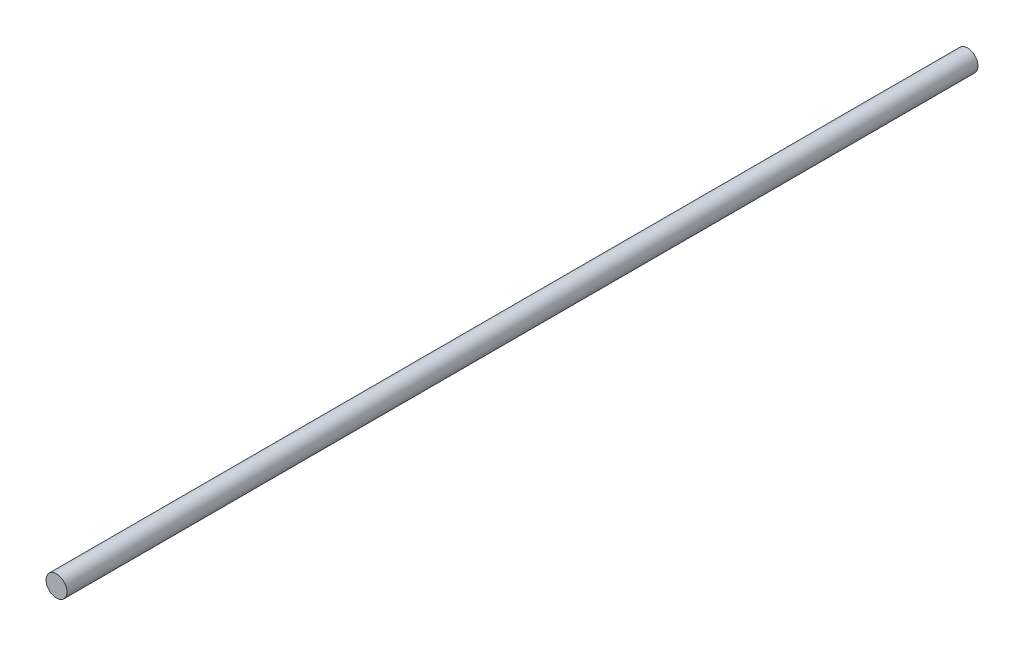
ISO-10303-21;
HEADER;
FILE_DESCRIPTION(('STEP AP214'),'2;1');
FILE_NAME('part.step','',(''),(''),'','','');
FILE_SCHEMA(('AUTOMOTIVE_DESIGN { 1 0 10303 214 1 1 1 1 }'));
ENDSEC;
DATA;
#1=APPLICATION_CONTEXT('core data for automotive mechanical design processes');
#2=APPLICATION_PROTOCOL_DEFINITION('international standard','automotive_design',2000,#1);
#3=PRODUCT_CONTEXT('',#1,'mechanical');
#4=PRODUCT('Part','Part','',(#3));
#5=PRODUCT_RELATED_PRODUCT_CATEGORY('part','',(#4));
#6=PRODUCT_DEFINITION_FORMATION('','',#4);
#7=PRODUCT_DEFINITION_CONTEXT('part definition',#1,'design');
#8=PRODUCT_DEFINITION('design','',#6,#7);
#9=PRODUCT_DEFINITION_SHAPE('','',#8);
#10=(LENGTH_UNIT() NAMED_UNIT(*) SI_UNIT(.MILLI.,.METRE.));
#11=(NAMED_UNIT(*) PLANE_ANGLE_UNIT() SI_UNIT($,.RADIAN.));
#12=(NAMED_UNIT(*) SI_UNIT($,.STERADIAN.) SOLID_ANGLE_UNIT());
#13=UNCERTAINTY_MEASURE_WITH_UNIT(LENGTH_MEASURE(1.E-05),#10,'distance_accuracy_value','');
#14=(GEOMETRIC_REPRESENTATION_CONTEXT(3) GLOBAL_UNCERTAINTY_ASSIGNED_CONTEXT((#13)) GLOBAL_UNIT_ASSIGNED_CONTEXT((#10,
#11,#12)) REPRESENTATION_CONTEXT('',''));
#15=CARTESIAN_POINT('',(0.,0.,0.));
#16=DIRECTION('',(0.,0.,1.));
#17=DIRECTION('',(1.,0.,0.));
#18=AXIS2_PLACEMENT_3D('',#15,#16,#17);
#19=CARTESIAN_POINT('',(0.,0.,260.));
#20=DIRECTION('',(0.,0.,-1.));
#21=DIRECTION('',(-1.,0.,0.));
#22=AXIS2_PLACEMENT_3D('',#19,#20,#21);
#23=CYLINDRICAL_SURFACE('',#22,3.);
#24=CARTESIAN_POINT('',(0.,0.,260.));
#25=DIRECTION('',(0.,0.,1.));
#26=DIRECTION('',(1.,0.,0.));
#27=AXIS2_PLACEMENT_3D('',#24,#25,#26);
#28=CIRCLE('',#27,3.);
#29=CARTESIAN_POINT('',(3.,0.,260.));
#30=VERTEX_POINT('',#29);
#31=EDGE_CURVE('E10',#30,#30,#28,.T.);
#32=ORIENTED_EDGE('',*,*,#31,.F.);
#33=EDGE_LOOP('',(#32));
#34=FACE_BOUND('',#33,.T.);
#35=CARTESIAN_POINT('',(0.,0.,0.));
#36=DIRECTION('',(0.,0.,1.));
#37=DIRECTION('',(1.,0.,0.));
#38=AXIS2_PLACEMENT_3D('',#35,#36,#37);
#39=CIRCLE('',#38,3.);
#40=CARTESIAN_POINT('',(3.,0.,0.));
#41=VERTEX_POINT('',#40);
#42=EDGE_CURVE('E34',#41,#41,#39,.T.);
#43=ORIENTED_EDGE('',*,*,#42,.T.);
#44=EDGE_LOOP('',(#43));
#45=FACE_BOUND('',#44,.T.);
#46=ADVANCED_FACE('F31',(#34,#45),#23,.T.);
#47=CARTESIAN_POINT('',(0.,0.,260.));
#48=DIRECTION('',(0.,0.,1.));
#49=DIRECTION('',(1.,0.,0.));
#50=AXIS2_PLACEMENT_3D('',#47,#48,#49);
#51=PLANE('',#50);
#52=ORIENTED_EDGE('',*,*,#31,.T.);
#53=EDGE_LOOP('',(#52));
#54=FACE_BOUND('',#53,.T.);
#55=ADVANCED_FACE('F46',(#54),#51,.T.);
#56=CARTESIAN_POINT('',(0.,0.,0.));
#57=DIRECTION('',(0.,0.,1.));
#58=DIRECTION('',(1.,0.,0.));
#59=AXIS2_PLACEMENT_3D('',#56,#57,#58);
#60=PLANE('',#59);
#61=ORIENTED_EDGE('',*,*,#42,.F.);
#62=EDGE_LOOP('',(#61));
#63=FACE_BOUND('',#62,.T.);
#64=ADVANCED_FACE('F44',(#63),#60,.F.);
#65=CLOSED_SHELL('',(#46,#55,#64));
#66=MANIFOLD_SOLID_BREP('B2',#65);
#67=ADVANCED_BREP_SHAPE_REPRESENTATION('',(#18,#66),#14);
#68=SHAPE_DEFINITION_REPRESENTATION(#9,#67);
ENDSEC;
END-ISO-10303-21;
